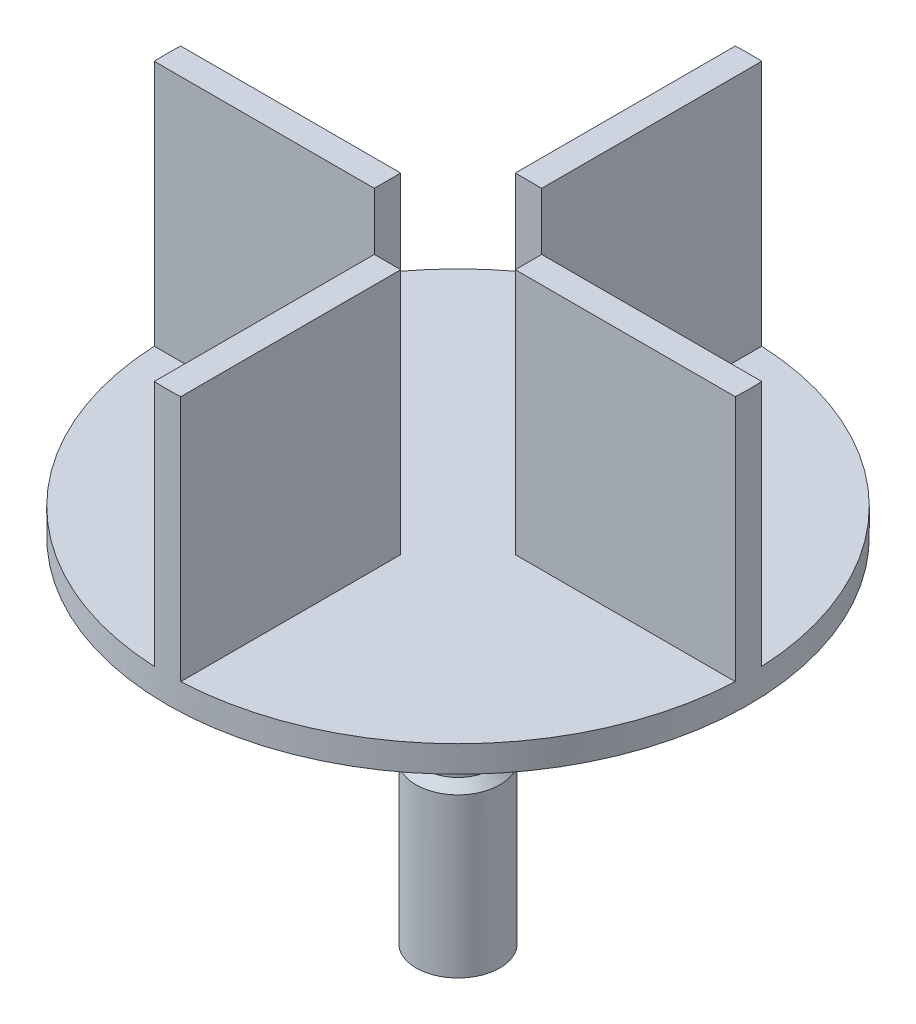
ISO-10303-21;
HEADER;
FILE_DESCRIPTION(('STEP AP214'),'2;1');
FILE_NAME('part.step','',(''),(''),'','','');
FILE_SCHEMA(('AUTOMOTIVE_DESIGN { 1 0 10303 214 1 1 1 1 }'));
ENDSEC;
DATA;
#1=APPLICATION_CONTEXT('core data for automotive mechanical design processes');
#2=APPLICATION_PROTOCOL_DEFINITION('international standard','automotive_design',2000,#1);
#3=PRODUCT_CONTEXT('',#1,'mechanical');
#4=PRODUCT('Part','Part','',(#3));
#5=PRODUCT_RELATED_PRODUCT_CATEGORY('part','',(#4));
#6=PRODUCT_DEFINITION_FORMATION('','',#4);
#7=PRODUCT_DEFINITION_CONTEXT('part definition',#1,'design');
#8=PRODUCT_DEFINITION('design','',#6,#7);
#9=PRODUCT_DEFINITION_SHAPE('','',#8);
#10=(LENGTH_UNIT() NAMED_UNIT(*) SI_UNIT(.MILLI.,.METRE.));
#11=(NAMED_UNIT(*) PLANE_ANGLE_UNIT() SI_UNIT($,.RADIAN.));
#12=(NAMED_UNIT(*) SI_UNIT($,.STERADIAN.) SOLID_ANGLE_UNIT());
#13=UNCERTAINTY_MEASURE_WITH_UNIT(LENGTH_MEASURE(1.E-05),#10,'distance_accuracy_value','');
#14=(GEOMETRIC_REPRESENTATION_CONTEXT(3) GLOBAL_UNCERTAINTY_ASSIGNED_CONTEXT((#13)) GLOBAL_UNIT_ASSIGNED_CONTEXT((#10,
#11,#12)) REPRESENTATION_CONTEXT('',''));
#15=CARTESIAN_POINT('',(0.,0.,0.));
#16=DIRECTION('',(0.,0.,1.));
#17=DIRECTION('',(1.,0.,0.));
#18=AXIS2_PLACEMENT_3D('',#15,#16,#17);
#19=CARTESIAN_POINT('',(0.,-40.,0.));
#20=DIRECTION('',(0.,1.,0.));
#21=DIRECTION('',(0.,0.,1.));
#22=AXIS2_PLACEMENT_3D('',#19,#20,#21);
#23=CYLINDRICAL_SURFACE('',#22,4.75);
#24=CARTESIAN_POINT('',(0.,-16.,0.));
#25=DIRECTION('',(0.,1.,0.));
#26=DIRECTION('',(0.,0.,1.));
#27=AXIS2_PLACEMENT_3D('',#24,#25,#26);
#28=CIRCLE('',#27,4.75);
#29=CARTESIAN_POINT('',(0.,-16.,4.75));
#30=VERTEX_POINT('',#29);
#31=EDGE_CURVE('E377',#30,#30,#28,.T.);
#32=ORIENTED_EDGE('',*,*,#31,.T.);
#33=EDGE_LOOP('',(#32));
#34=FACE_BOUND('',#33,.T.);
#35=CARTESIAN_POINT('',(0.,0.,0.));
#36=DIRECTION('',(0.,1.,0.));
#37=DIRECTION('',(0.,0.,1.));
#38=AXIS2_PLACEMENT_3D('',#35,#36,#37);
#39=CIRCLE('',#38,4.75);
#40=CARTESIAN_POINT('',(0.,0.,4.75));
#41=VERTEX_POINT('',#40);
#42=EDGE_CURVE('E11',#41,#41,#39,.F.);
#43=ORIENTED_EDGE('',*,*,#42,.T.);
#44=EDGE_LOOP('',(#43));
#45=FACE_BOUND('',#44,.T.);
#46=ADVANCED_FACE('F39',(#34,#45),#23,.T.);
#47=CARTESIAN_POINT('',(0.,3.,0.));
#48=DIRECTION('',(0.,1.,0.));
#49=DIRECTION('',(0.,0.,1.));
#50=AXIS2_PLACEMENT_3D('',#47,#48,#49);
#51=PLANE('',#50);
#52=CARTESIAN_POINT('',(0.,3.,0.));
#53=DIRECTION('',(0.,1.,0.));
#54=DIRECTION('',(0.,0.,1.));
#55=AXIS2_PLACEMENT_3D('',#52,#53,#54);
#56=CIRCLE('',#55,33.);
#57=CARTESIAN_POINT('',(1.50000000000001,3.,32.9658914637539));
#58=VERTEX_POINT('',#57);
#59=CARTESIAN_POINT('',(32.9658914637539,3.,1.49999999999966));
#60=VERTEX_POINT('',#59);
#61=EDGE_CURVE('E316',#58,#60,#56,.T.);
#62=ORIENTED_EDGE('',*,*,#61,.T.);
#63=DIRECTION('',(1.,0.,0.));
#64=VECTOR('',#63,1.);
#65=CARTESIAN_POINT('',(0.,3.,1.5));
#66=LINE('',#65,#64);
#67=CARTESIAN_POINT('',(8.00000000000002,3.,1.49999999999992));
#68=VERTEX_POINT('',#67);
#69=EDGE_CURVE('E55',#68,#60,#66,.T.);
#70=ORIENTED_EDGE('',*,*,#69,.F.);
#71=DIRECTION('',(0.,0.,1.));
#72=VECTOR('',#71,1.);
#73=CARTESIAN_POINT('',(8.,3.,0.));
#74=LINE('',#73,#72);
#75=CARTESIAN_POINT('',(7.99999999999998,3.,-1.50000000000008));
#76=VERTEX_POINT('',#75);
#77=EDGE_CURVE('E60',#76,#68,#74,.T.);
#78=ORIENTED_EDGE('',*,*,#77,.F.);
#79=DIRECTION('',(1.,0.,0.));
#80=VECTOR('',#79,1.);
#81=CARTESIAN_POINT('',(0.,3.,-1.49999999999999));
#82=LINE('',#81,#80);
#83=CARTESIAN_POINT('',(32.9658914637538,3.,-1.50000000000035));
#84=VERTEX_POINT('',#83);
#85=EDGE_CURVE('E172',#76,#84,#82,.T.);
#86=ORIENTED_EDGE('',*,*,#85,.T.);
#87=CARTESIAN_POINT('',(1.5,3.,-32.9658914637539));
#88=VERTEX_POINT('',#87);
#89=EDGE_CURVE('E310',#84,#88,#56,.T.);
#90=ORIENTED_EDGE('',*,*,#89,.T.);
#91=DIRECTION('',(0.,0.,-1.));
#92=VECTOR('',#91,1.);
#93=CARTESIAN_POINT('',(1.5,3.,0.));
#94=LINE('',#93,#92);
#95=CARTESIAN_POINT('',(1.5,3.,-8.));
#96=VERTEX_POINT('',#95);
#97=EDGE_CURVE('E286',#96,#88,#94,.T.);
#98=ORIENTED_EDGE('',*,*,#97,.F.);
#99=DIRECTION('',(1.,0.,0.));
#100=VECTOR('',#99,1.);
#101=CARTESIAN_POINT('',(0.,3.,-8.));
#102=LINE('',#101,#100);
#103=CARTESIAN_POINT('',(-1.5,3.,-8.));
#104=VERTEX_POINT('',#103);
#105=EDGE_CURVE('E266',#104,#96,#102,.T.);
#106=ORIENTED_EDGE('',*,*,#105,.F.);
#107=DIRECTION('',(0.,0.,-1.));
#108=VECTOR('',#107,1.);
#109=CARTESIAN_POINT('',(-1.49999999999999,3.,0.));
#110=LINE('',#109,#108);
#111=CARTESIAN_POINT('',(-1.50000000000001,3.,-32.9658914637539));
#112=VERTEX_POINT('',#111);
#113=EDGE_CURVE('E272',#104,#112,#110,.T.);
#114=ORIENTED_EDGE('',*,*,#113,.T.);
#115=CARTESIAN_POINT('',(-32.9658914637539,3.,-1.49999999999989));
#116=VERTEX_POINT('',#115);
#117=EDGE_CURVE('E48',#112,#116,#56,.T.);
#118=ORIENTED_EDGE('',*,*,#117,.T.);
#119=DIRECTION('',(-1.,0.,0.));
#120=VECTOR('',#119,1.);
#121=CARTESIAN_POINT('',(0.,3.,-1.5));
#122=LINE('',#121,#120);
#123=CARTESIAN_POINT('',(-8.00000000000001,3.,-1.49999999999998));
#124=VERTEX_POINT('',#123);
#125=EDGE_CURVE('E244',#124,#116,#122,.T.);
#126=ORIENTED_EDGE('',*,*,#125,.F.);
#127=DIRECTION('',(0.,0.,-1.));
#128=VECTOR('',#127,1.);
#129=CARTESIAN_POINT('',(-8.,3.,0.));
#130=LINE('',#129,#128);
#131=CARTESIAN_POINT('',(-7.99999999999999,3.,1.50000000000002));
#132=VERTEX_POINT('',#131);
#133=EDGE_CURVE('E224',#132,#124,#130,.T.);
#134=ORIENTED_EDGE('',*,*,#133,.F.);
#135=DIRECTION('',(-1.,0.,0.));
#136=VECTOR('',#135,1.);
#137=CARTESIAN_POINT('',(0.,3.,1.49999999999999));
#138=LINE('',#137,#136);
#139=CARTESIAN_POINT('',(-32.9658914637539,3.,1.50000000000012));
#140=VERTEX_POINT('',#139);
#141=EDGE_CURVE('E230',#132,#140,#138,.T.);
#142=ORIENTED_EDGE('',*,*,#141,.T.);
#143=CARTESIAN_POINT('',(-1.5,3.,32.9658914637539));
#144=VERTEX_POINT('',#143);
#145=EDGE_CURVE('E309',#140,#144,#56,.T.);
#146=ORIENTED_EDGE('',*,*,#145,.T.);
#147=DIRECTION('',(0.,0.,1.));
#148=VECTOR('',#147,1.);
#149=CARTESIAN_POINT('',(-1.5,3.,0.));
#150=LINE('',#149,#148);
#151=CARTESIAN_POINT('',(-1.5,3.,8.));
#152=VERTEX_POINT('',#151);
#153=EDGE_CURVE('E181',#152,#144,#150,.T.);
#154=ORIENTED_EDGE('',*,*,#153,.F.);
#155=DIRECTION('',(-1.,0.,0.));
#156=VECTOR('',#155,1.);
#157=CARTESIAN_POINT('',(0.,3.,8.));
#158=LINE('',#157,#156);
#159=CARTESIAN_POINT('',(1.5,3.,8.));
#160=VERTEX_POINT('',#159);
#161=EDGE_CURVE('E176',#160,#152,#158,.T.);
#162=ORIENTED_EDGE('',*,*,#161,.F.);
#163=DIRECTION('',(0.,0.,1.));
#164=VECTOR('',#163,1.);
#165=CARTESIAN_POINT('',(1.49999999999999,3.,0.));
#166=LINE('',#165,#164);
#167=EDGE_CURVE('E192',#160,#58,#166,.T.);
#168=ORIENTED_EDGE('',*,*,#167,.T.);
#169=EDGE_LOOP('',(#62,#70,#78,#86,#90,#98,#106,#114,#118,#126,#134,#142,#146,#154,#162,#168));
#170=FACE_BOUND('',#169,.T.);
#171=ADVANCED_FACE('F319',(#170),#51,.T.);
#172=CARTESIAN_POINT('',(0.,3.,0.));
#173=DIRECTION('',(0.,-1.,0.));
#174=DIRECTION('',(0.,0.,-1.));
#175=AXIS2_PLACEMENT_3D('',#172,#173,#174);
#176=CYLINDRICAL_SURFACE('',#175,33.);
#177=ORIENTED_EDGE('',*,*,#117,.F.);
#178=DIRECTION('',(0.,-1.,0.));
#179=VECTOR('',#178,1.);
#180=CARTESIAN_POINT('',(-1.50000000000001,31.,-32.9658914637539));
#181=LINE('',#180,#179);
#182=CARTESIAN_POINT('',(-1.50000000000001,31.,-32.9658914637539));
#183=VERTEX_POINT('',#182);
#184=EDGE_CURVE('E295',#183,#112,#181,.T.);
#185=ORIENTED_EDGE('',*,*,#184,.F.);
#186=CARTESIAN_POINT('',(0.,31.,0.));
#187=DIRECTION('',(0.,1.,0.));
#188=DIRECTION('',(0.,0.,1.));
#189=AXIS2_PLACEMENT_3D('',#186,#187,#188);
#190=CIRCLE('',#189,33.);
#191=CARTESIAN_POINT('',(1.5,31.,-32.9658914637539));
#192=VERTEX_POINT('',#191);
#193=EDGE_CURVE('E275',#192,#183,#190,.T.);
#194=ORIENTED_EDGE('',*,*,#193,.F.);
#195=DIRECTION('',(0.,-1.,0.));
#196=VECTOR('',#195,1.);
#197=CARTESIAN_POINT('',(1.5,31.,-32.9658914637539));
#198=LINE('',#197,#196);
#199=EDGE_CURVE('E299',#192,#88,#198,.T.);
#200=ORIENTED_EDGE('',*,*,#199,.T.);
#201=ORIENTED_EDGE('',*,*,#89,.F.);
#202=DIRECTION('',(0.,-1.,0.));
#203=VECTOR('',#202,1.);
#204=CARTESIAN_POINT('',(32.9658914637538,31.,-1.50000000000035));
#205=LINE('',#204,#203);
#206=CARTESIAN_POINT('',(32.9658914637538,31.,-1.50000000000035));
#207=VERTEX_POINT('',#206);
#208=EDGE_CURVE('E183',#207,#84,#205,.T.);
#209=ORIENTED_EDGE('',*,*,#208,.F.);
#210=CARTESIAN_POINT('',(0.,31.,0.));
#211=DIRECTION('',(0.,1.,0.));
#212=DIRECTION('',(-1.,0.,0.));
#213=AXIS2_PLACEMENT_3D('',#210,#211,#212);
#214=CIRCLE('',#213,33.);
#215=CARTESIAN_POINT('',(32.9658914637539,31.,1.49999999999966));
#216=VERTEX_POINT('',#215);
#217=EDGE_CURVE('E162',#216,#207,#214,.T.);
#218=ORIENTED_EDGE('',*,*,#217,.F.);
#219=DIRECTION('',(0.,-1.,0.));
#220=VECTOR('',#219,1.);
#221=CARTESIAN_POINT('',(32.9658914637539,31.,1.49999999999966));
#222=LINE('',#221,#220);
#223=EDGE_CURVE('E158',#216,#60,#222,.T.);
#224=ORIENTED_EDGE('',*,*,#223,.T.);
#225=ORIENTED_EDGE('',*,*,#61,.F.);
#226=DIRECTION('',(0.,-1.,0.));
#227=VECTOR('',#226,1.);
#228=CARTESIAN_POINT('',(1.50000000000001,31.,32.9658914637539));
#229=LINE('',#228,#227);
#230=CARTESIAN_POINT('',(1.50000000000001,31.,32.9658914637539));
#231=VERTEX_POINT('',#230);
#232=EDGE_CURVE('E212',#231,#58,#229,.T.);
#233=ORIENTED_EDGE('',*,*,#232,.F.);
#234=CARTESIAN_POINT('',(0.,31.,0.));
#235=DIRECTION('',(0.,1.,0.));
#236=DIRECTION('',(0.,0.,-1.));
#237=AXIS2_PLACEMENT_3D('',#234,#235,#236);
#238=CIRCLE('',#237,33.);
#239=CARTESIAN_POINT('',(-1.5,31.,32.9658914637539));
#240=VERTEX_POINT('',#239);
#241=EDGE_CURVE('E195',#240,#231,#238,.T.);
#242=ORIENTED_EDGE('',*,*,#241,.F.);
#243=DIRECTION('',(0.,-1.,0.));
#244=VECTOR('',#243,1.);
#245=CARTESIAN_POINT('',(-1.5,31.,32.9658914637539));
#246=LINE('',#245,#244);
#247=EDGE_CURVE('E216',#240,#144,#246,.T.);
#248=ORIENTED_EDGE('',*,*,#247,.T.);
#249=ORIENTED_EDGE('',*,*,#145,.F.);
#250=DIRECTION('',(0.,-1.,0.));
#251=VECTOR('',#250,1.);
#252=CARTESIAN_POINT('',(-32.9658914637539,31.,1.50000000000012));
#253=LINE('',#252,#251);
#254=CARTESIAN_POINT('',(-32.9658914637539,31.,1.50000000000012));
#255=VERTEX_POINT('',#254);
#256=EDGE_CURVE('E254',#255,#140,#253,.T.);
#257=ORIENTED_EDGE('',*,*,#256,.F.);
#258=CARTESIAN_POINT('',(0.,31.,0.));
#259=DIRECTION('',(0.,1.,0.));
#260=DIRECTION('',(1.,0.,0.));
#261=AXIS2_PLACEMENT_3D('',#258,#259,#260);
#262=CIRCLE('',#261,33.);
#263=CARTESIAN_POINT('',(-32.9658914637539,31.,-1.49999999999989));
#264=VERTEX_POINT('',#263);
#265=EDGE_CURVE('E233',#264,#255,#262,.T.);
#266=ORIENTED_EDGE('',*,*,#265,.F.);
#267=DIRECTION('',(0.,-1.,0.));
#268=VECTOR('',#267,1.);
#269=CARTESIAN_POINT('',(-32.9658914637539,31.,-1.49999999999989));
#270=LINE('',#269,#268);
#271=EDGE_CURVE('E258',#264,#116,#270,.T.);
#272=ORIENTED_EDGE('',*,*,#271,.T.);
#273=EDGE_LOOP('',(#177,#185,#194,#200,#201,#209,#218,#224,#225,#233,#242,#248,#249,#257,#266,#272));
#274=FACE_BOUND('',#273,.T.);
#275=CARTESIAN_POINT('',(0.,0.,0.));
#276=DIRECTION('',(0.,1.,0.));
#277=DIRECTION('',(0.,0.,1.));
#278=AXIS2_PLACEMENT_3D('',#275,#276,#277);
#279=CIRCLE('',#278,33.);
#280=CARTESIAN_POINT('',(0.,0.,33.));
#281=VERTEX_POINT('',#280);
#282=EDGE_CURVE('E307',#281,#281,#279,.T.);
#283=ORIENTED_EDGE('',*,*,#282,.T.);
#284=EDGE_LOOP('',(#283));
#285=FACE_BOUND('',#284,.T.);
#286=ADVANCED_FACE('F41',(#274,#285),#176,.T.);
#287=CARTESIAN_POINT('',(0.,0.,0.));
#288=DIRECTION('',(0.,1.,0.));
#289=DIRECTION('',(0.,0.,1.));
#290=AXIS2_PLACEMENT_3D('',#287,#288,#289);
#291=PLANE('',#290);
#292=ORIENTED_EDGE('',*,*,#42,.F.);
#293=EDGE_LOOP('',(#292));
#294=FACE_BOUND('',#293,.T.);
#295=ORIENTED_EDGE('',*,*,#282,.F.);
#296=EDGE_LOOP('',(#295));
#297=FACE_BOUND('',#296,.T.);
#298=ADVANCED_FACE('F450',(#294,#297),#291,.F.);
#299=CARTESIAN_POINT('',(0.,31.,-8.));
#300=DIRECTION('',(0.,0.,-1.));
#301=DIRECTION('',(-1.,0.,0.));
#302=AXIS2_PLACEMENT_3D('',#299,#300,#301);
#303=PLANE('',#302);
#304=ORIENTED_EDGE('',*,*,#105,.T.);
#305=DIRECTION('',(0.,-1.,0.));
#306=VECTOR('',#305,1.);
#307=CARTESIAN_POINT('',(1.5,31.,-8.));
#308=LINE('',#307,#306);
#309=CARTESIAN_POINT('',(1.5,31.,-8.));
#310=VERTEX_POINT('',#309);
#311=EDGE_CURVE('E303',#310,#96,#308,.T.);
#312=ORIENTED_EDGE('',*,*,#311,.F.);
#313=DIRECTION('',(1.,0.,0.));
#314=VECTOR('',#313,1.);
#315=CARTESIAN_POINT('',(0.,31.,-8.));
#316=LINE('',#315,#314);
#317=CARTESIAN_POINT('',(-1.5,31.,-8.));
#318=VERTEX_POINT('',#317);
#319=EDGE_CURVE('E267',#318,#310,#316,.T.);
#320=ORIENTED_EDGE('',*,*,#319,.F.);
#321=DIRECTION('',(0.,-1.,0.));
#322=VECTOR('',#321,1.);
#323=CARTESIAN_POINT('',(-1.5,31.,-8.));
#324=LINE('',#323,#322);
#325=EDGE_CURVE('E282',#318,#104,#324,.T.);
#326=ORIENTED_EDGE('',*,*,#325,.T.);
#327=EDGE_LOOP('',(#304,#312,#320,#326));
#328=FACE_BOUND('',#327,.T.);
#329=ADVANCED_FACE('F411',(#328),#303,.F.);
#330=CARTESIAN_POINT('',(1.5,31.,0.));
#331=DIRECTION('',(-1.,0.,0.));
#332=DIRECTION('',(0.,0.,1.));
#333=AXIS2_PLACEMENT_3D('',#330,#331,#332);
#334=PLANE('',#333);
#335=ORIENTED_EDGE('',*,*,#97,.T.);
#336=ORIENTED_EDGE('',*,*,#199,.F.);
#337=DIRECTION('',(0.,0.,-1.));
#338=VECTOR('',#337,1.);
#339=CARTESIAN_POINT('',(1.5,31.,0.));
#340=LINE('',#339,#338);
#341=EDGE_CURVE('E271',#310,#192,#340,.T.);
#342=ORIENTED_EDGE('',*,*,#341,.F.);
#343=ORIENTED_EDGE('',*,*,#311,.T.);
#344=EDGE_LOOP('',(#335,#336,#342,#343));
#345=FACE_BOUND('',#344,.T.);
#346=ADVANCED_FACE('F406',(#345),#334,.F.);
#347=CARTESIAN_POINT('',(-1.49999999999999,31.,0.));
#348=DIRECTION('',(-1.,0.,0.));
#349=DIRECTION('',(0.,0.,1.));
#350=AXIS2_PLACEMENT_3D('',#347,#348,#349);
#351=PLANE('',#350);
#352=ORIENTED_EDGE('',*,*,#113,.F.);
#353=ORIENTED_EDGE('',*,*,#325,.F.);
#354=DIRECTION('',(0.,0.,-1.));
#355=VECTOR('',#354,1.);
#356=CARTESIAN_POINT('',(-1.49999999999999,31.,0.));
#357=LINE('',#356,#355);
#358=EDGE_CURVE('E278',#318,#183,#357,.T.);
#359=ORIENTED_EDGE('',*,*,#358,.T.);
#360=ORIENTED_EDGE('',*,*,#184,.T.);
#361=EDGE_LOOP('',(#352,#353,#359,#360));
#362=FACE_BOUND('',#361,.T.);
#363=ADVANCED_FACE('F414',(#362),#351,.T.);
#364=CARTESIAN_POINT('',(0.,31.,0.));
#365=DIRECTION('',(0.,1.,0.));
#366=DIRECTION('',(0.,0.,1.));
#367=AXIS2_PLACEMENT_3D('',#364,#365,#366);
#368=PLANE('',#367);
#369=ORIENTED_EDGE('',*,*,#319,.T.);
#370=ORIENTED_EDGE('',*,*,#341,.T.);
#371=ORIENTED_EDGE('',*,*,#193,.T.);
#372=ORIENTED_EDGE('',*,*,#358,.F.);
#373=EDGE_LOOP('',(#369,#370,#371,#372));
#374=FACE_BOUND('',#373,.T.);
#375=ADVANCED_FACE('F441',(#374),#368,.T.);
#376=CARTESIAN_POINT('',(-8.,31.,0.));
#377=DIRECTION('',(-1.,0.,0.));
#378=DIRECTION('',(0.,0.,1.));
#379=AXIS2_PLACEMENT_3D('',#376,#377,#378);
#380=PLANE('',#379);
#381=ORIENTED_EDGE('',*,*,#133,.T.);
#382=DIRECTION('',(0.,-1.,0.));
#383=VECTOR('',#382,1.);
#384=CARTESIAN_POINT('',(-8.00000000000001,31.,-1.49999999999998));
#385=LINE('',#384,#383);
#386=CARTESIAN_POINT('',(-8.00000000000001,31.,-1.49999999999998));
#387=VERTEX_POINT('',#386);
#388=EDGE_CURVE('E262',#387,#124,#385,.T.);
#389=ORIENTED_EDGE('',*,*,#388,.F.);
#390=DIRECTION('',(0.,0.,-1.));
#391=VECTOR('',#390,1.);
#392=CARTESIAN_POINT('',(-8.,31.,0.));
#393=LINE('',#392,#391);
#394=CARTESIAN_POINT('',(-7.99999999999999,31.,1.50000000000002));
#395=VERTEX_POINT('',#394);
#396=EDGE_CURVE('E225',#395,#387,#393,.T.);
#397=ORIENTED_EDGE('',*,*,#396,.F.);
#398=DIRECTION('',(0.,-1.,0.));
#399=VECTOR('',#398,1.);
#400=CARTESIAN_POINT('',(-7.99999999999999,31.,1.50000000000002));
#401=LINE('',#400,#399);
#402=EDGE_CURVE('E240',#395,#132,#401,.T.);
#403=ORIENTED_EDGE('',*,*,#402,.T.);
#404=EDGE_LOOP('',(#381,#389,#397,#403));
#405=FACE_BOUND('',#404,.T.);
#406=ADVANCED_FACE('F422',(#405),#380,.F.);
#407=CARTESIAN_POINT('',(0.,31.,-1.5));
#408=DIRECTION('',(0.,0.,1.));
#409=DIRECTION('',(1.,0.,0.));
#410=AXIS2_PLACEMENT_3D('',#407,#408,#409);
#411=PLANE('',#410);
#412=ORIENTED_EDGE('',*,*,#125,.T.);
#413=ORIENTED_EDGE('',*,*,#271,.F.);
#414=DIRECTION('',(-1.,0.,0.));
#415=VECTOR('',#414,1.);
#416=CARTESIAN_POINT('',(0.,31.,-1.5));
#417=LINE('',#416,#415);
#418=EDGE_CURVE('E229',#387,#264,#417,.T.);
#419=ORIENTED_EDGE('',*,*,#418,.F.);
#420=ORIENTED_EDGE('',*,*,#388,.T.);
#421=EDGE_LOOP('',(#412,#413,#419,#420));
#422=FACE_BOUND('',#421,.T.);
#423=ADVANCED_FACE('F418',(#422),#411,.F.);
#424=CARTESIAN_POINT('',(0.,31.,1.49999999999999));
#425=DIRECTION('',(0.,0.,1.));
#426=DIRECTION('',(1.,0.,0.));
#427=AXIS2_PLACEMENT_3D('',#424,#425,#426);
#428=PLANE('',#427);
#429=ORIENTED_EDGE('',*,*,#141,.F.);
#430=ORIENTED_EDGE('',*,*,#402,.F.);
#431=DIRECTION('',(-1.,0.,0.));
#432=VECTOR('',#431,1.);
#433=CARTESIAN_POINT('',(0.,31.,1.49999999999999));
#434=LINE('',#433,#432);
#435=EDGE_CURVE('E236',#395,#255,#434,.T.);
#436=ORIENTED_EDGE('',*,*,#435,.T.);
#437=ORIENTED_EDGE('',*,*,#256,.T.);
#438=EDGE_LOOP('',(#429,#430,#436,#437));
#439=FACE_BOUND('',#438,.T.);
#440=ADVANCED_FACE('F425',(#439),#428,.T.);
#441=CARTESIAN_POINT('',(0.,31.,0.));
#442=DIRECTION('',(0.,1.,0.));
#443=DIRECTION('',(1.,0.,0.));
#444=AXIS2_PLACEMENT_3D('',#441,#442,#443);
#445=PLANE('',#444);
#446=ORIENTED_EDGE('',*,*,#396,.T.);
#447=ORIENTED_EDGE('',*,*,#418,.T.);
#448=ORIENTED_EDGE('',*,*,#265,.T.);
#449=ORIENTED_EDGE('',*,*,#435,.F.);
#450=EDGE_LOOP('',(#446,#447,#448,#449));
#451=FACE_BOUND('',#450,.T.);
#452=ADVANCED_FACE('F427',(#451),#445,.T.);
#453=CARTESIAN_POINT('',(0.,31.,8.));
#454=DIRECTION('',(0.,0.,1.));
#455=DIRECTION('',(1.,0.,0.));
#456=AXIS2_PLACEMENT_3D('',#453,#454,#455);
#457=PLANE('',#456);
#458=ORIENTED_EDGE('',*,*,#161,.T.);
#459=DIRECTION('',(0.,-1.,0.));
#460=VECTOR('',#459,1.);
#461=CARTESIAN_POINT('',(-1.5,31.,8.));
#462=LINE('',#461,#460);
#463=CARTESIAN_POINT('',(-1.5,31.,8.));
#464=VERTEX_POINT('',#463);
#465=EDGE_CURVE('E220',#464,#152,#462,.T.);
#466=ORIENTED_EDGE('',*,*,#465,.F.);
#467=DIRECTION('',(-1.,0.,0.));
#468=VECTOR('',#467,1.);
#469=CARTESIAN_POINT('',(0.,31.,8.));
#470=LINE('',#469,#468);
#471=CARTESIAN_POINT('',(1.5,31.,8.));
#472=VERTEX_POINT('',#471);
#473=EDGE_CURVE('E187',#472,#464,#470,.T.);
#474=ORIENTED_EDGE('',*,*,#473,.F.);
#475=DIRECTION('',(0.,-1.,0.));
#476=VECTOR('',#475,1.);
#477=CARTESIAN_POINT('',(1.5,31.,8.));
#478=LINE('',#477,#476);
#479=EDGE_CURVE('E201',#472,#160,#478,.T.);
#480=ORIENTED_EDGE('',*,*,#479,.T.);
#481=EDGE_LOOP('',(#458,#466,#474,#480));
#482=FACE_BOUND('',#481,.T.);
#483=ADVANCED_FACE('F335',(#482),#457,.F.);
#484=CARTESIAN_POINT('',(-1.5,31.,0.));
#485=DIRECTION('',(1.,0.,0.));
#486=DIRECTION('',(0.,0.,-1.));
#487=AXIS2_PLACEMENT_3D('',#484,#485,#486);
#488=PLANE('',#487);
#489=ORIENTED_EDGE('',*,*,#153,.T.);
#490=ORIENTED_EDGE('',*,*,#247,.F.);
#491=DIRECTION('',(0.,0.,1.));
#492=VECTOR('',#491,1.);
#493=CARTESIAN_POINT('',(-1.5,31.,0.));
#494=LINE('',#493,#492);
#495=EDGE_CURVE('E191',#464,#240,#494,.T.);
#496=ORIENTED_EDGE('',*,*,#495,.F.);
#497=ORIENTED_EDGE('',*,*,#465,.T.);
#498=EDGE_LOOP('',(#489,#490,#496,#497));
#499=FACE_BOUND('',#498,.T.);
#500=ADVANCED_FACE('F325',(#499),#488,.F.);
#501=CARTESIAN_POINT('',(1.49999999999999,31.,0.));
#502=DIRECTION('',(1.,0.,0.));
#503=DIRECTION('',(0.,0.,-1.));
#504=AXIS2_PLACEMENT_3D('',#501,#502,#503);
#505=PLANE('',#504);
#506=ORIENTED_EDGE('',*,*,#167,.F.);
#507=ORIENTED_EDGE('',*,*,#479,.F.);
#508=DIRECTION('',(0.,0.,1.));
#509=VECTOR('',#508,1.);
#510=CARTESIAN_POINT('',(1.49999999999999,31.,0.));
#511=LINE('',#510,#509);
#512=EDGE_CURVE('E198',#472,#231,#511,.T.);
#513=ORIENTED_EDGE('',*,*,#512,.T.);
#514=ORIENTED_EDGE('',*,*,#232,.T.);
#515=EDGE_LOOP('',(#506,#507,#513,#514));
#516=FACE_BOUND('',#515,.T.);
#517=ADVANCED_FACE('F338',(#516),#505,.T.);
#518=CARTESIAN_POINT('',(0.,31.,0.));
#519=DIRECTION('',(0.,1.,0.));
#520=DIRECTION('',(0.,0.,-1.));
#521=AXIS2_PLACEMENT_3D('',#518,#519,#520);
#522=PLANE('',#521);
#523=ORIENTED_EDGE('',*,*,#473,.T.);
#524=ORIENTED_EDGE('',*,*,#495,.T.);
#525=ORIENTED_EDGE('',*,*,#241,.T.);
#526=ORIENTED_EDGE('',*,*,#512,.F.);
#527=EDGE_LOOP('',(#523,#524,#525,#526));
#528=FACE_BOUND('',#527,.T.);
#529=ADVANCED_FACE('F332',(#528),#522,.T.);
#530=CARTESIAN_POINT('',(8.,31.,0.));
#531=DIRECTION('',(1.,0.,0.));
#532=DIRECTION('',(0.,0.,-1.));
#533=AXIS2_PLACEMENT_3D('',#530,#531,#532);
#534=PLANE('',#533);
#535=ORIENTED_EDGE('',*,*,#77,.T.);
#536=DIRECTION('',(0.,-1.,0.));
#537=VECTOR('',#536,1.);
#538=CARTESIAN_POINT('',(8.00000000000002,31.,1.49999999999992));
#539=LINE('',#538,#537);
#540=CARTESIAN_POINT('',(8.00000000000002,31.,1.49999999999992));
#541=VERTEX_POINT('',#540);
#542=EDGE_CURVE('E156',#541,#68,#539,.T.);
#543=ORIENTED_EDGE('',*,*,#542,.F.);
#544=DIRECTION('',(0.,0.,1.));
#545=VECTOR('',#544,1.);
#546=CARTESIAN_POINT('',(8.,31.,0.));
#547=LINE('',#546,#545);
#548=CARTESIAN_POINT('',(7.99999999999998,31.,-1.50000000000008));
#549=VERTEX_POINT('',#548);
#550=EDGE_CURVE('E163',#549,#541,#547,.T.);
#551=ORIENTED_EDGE('',*,*,#550,.F.);
#552=DIRECTION('',(0.,-1.,0.));
#553=VECTOR('',#552,1.);
#554=CARTESIAN_POINT('',(7.99999999999998,31.,-1.50000000000008));
#555=LINE('',#554,#553);
#556=EDGE_CURVE('E389',#549,#76,#555,.T.);
#557=ORIENTED_EDGE('',*,*,#556,.T.);
#558=EDGE_LOOP('',(#535,#543,#551,#557));
#559=FACE_BOUND('',#558,.T.);
#560=ADVANCED_FACE('F174',(#559),#534,.F.);
#561=CARTESIAN_POINT('',(0.,31.,1.5));
#562=DIRECTION('',(0.,0.,-1.));
#563=DIRECTION('',(-1.,0.,0.));
#564=AXIS2_PLACEMENT_3D('',#561,#562,#563);
#565=PLANE('',#564);
#566=ORIENTED_EDGE('',*,*,#69,.T.);
#567=ORIENTED_EDGE('',*,*,#223,.F.);
#568=DIRECTION('',(1.,0.,0.));
#569=VECTOR('',#568,1.);
#570=CARTESIAN_POINT('',(0.,31.,1.5));
#571=LINE('',#570,#569);
#572=EDGE_CURVE('E152',#541,#216,#571,.T.);
#573=ORIENTED_EDGE('',*,*,#572,.F.);
#574=ORIENTED_EDGE('',*,*,#542,.T.);
#575=EDGE_LOOP('',(#566,#567,#573,#574));
#576=FACE_BOUND('',#575,.T.);
#577=ADVANCED_FACE('F154',(#576),#565,.F.);
#578=CARTESIAN_POINT('',(0.,31.,-1.49999999999999));
#579=DIRECTION('',(0.,0.,-1.));
#580=DIRECTION('',(-1.,0.,0.));
#581=AXIS2_PLACEMENT_3D('',#578,#579,#580);
#582=PLANE('',#581);
#583=ORIENTED_EDGE('',*,*,#85,.F.);
#584=ORIENTED_EDGE('',*,*,#556,.F.);
#585=DIRECTION('',(1.,0.,0.));
#586=VECTOR('',#585,1.);
#587=CARTESIAN_POINT('',(0.,31.,-1.49999999999999));
#588=LINE('',#587,#586);
#589=EDGE_CURVE('E169',#549,#207,#588,.T.);
#590=ORIENTED_EDGE('',*,*,#589,.T.);
#591=ORIENTED_EDGE('',*,*,#208,.T.);
#592=EDGE_LOOP('',(#583,#584,#590,#591));
#593=FACE_BOUND('',#592,.T.);
#594=ADVANCED_FACE('F401',(#593),#582,.T.);
#595=CARTESIAN_POINT('',(0.,31.,0.));
#596=DIRECTION('',(0.,1.,0.));
#597=DIRECTION('',(-1.,0.,0.));
#598=AXIS2_PLACEMENT_3D('',#595,#596,#597);
#599=PLANE('',#598);
#600=ORIENTED_EDGE('',*,*,#550,.T.);
#601=ORIENTED_EDGE('',*,*,#572,.T.);
#602=ORIENTED_EDGE('',*,*,#217,.T.);
#603=ORIENTED_EDGE('',*,*,#589,.F.);
#604=EDGE_LOOP('',(#600,#601,#602,#603));
#605=FACE_BOUND('',#604,.T.);
#606=ADVANCED_FACE('F167',(#605),#599,.T.);
#607=CARTESIAN_POINT('',(0.,-17.,0.));
#608=DIRECTION('',(0.,1.,0.));
#609=DIRECTION('',(0.,0.,1.));
#610=AXIS2_PLACEMENT_3D('',#607,#608,#609);
#611=CONICAL_SURFACE('',#610,3.75,0.785398163397443);
#612=ORIENTED_EDGE('',*,*,#31,.F.);
#613=EDGE_LOOP('',(#612));
#614=FACE_BOUND('',#613,.T.);
#615=CARTESIAN_POINT('',(0.,-17.,0.));
#616=DIRECTION('',(0.,1.,0.));
#617=DIRECTION('',(0.,0.,1.));
#618=AXIS2_PLACEMENT_3D('',#615,#616,#617);
#619=CIRCLE('',#618,3.75);
#620=CARTESIAN_POINT('',(0.,-17.,3.75));
#621=VERTEX_POINT('',#620);
#622=EDGE_CURVE('E382',#621,#621,#619,.T.);
#623=ORIENTED_EDGE('',*,*,#622,.T.);
#624=EDGE_LOOP('',(#623));
#625=FACE_BOUND('',#624,.T.);
#626=ADVANCED_FACE('F557',(#614,#625),#611,.T.);
#627=CARTESIAN_POINT('',(0.,0.,0.));
#628=DIRECTION('',(0.,1.,0.));
#629=DIRECTION('',(0.,0.,1.));
#630=AXIS2_PLACEMENT_3D('',#627,#628,#629);
#631=CYLINDRICAL_SURFACE('',#630,3.75);
#632=ORIENTED_EDGE('',*,*,#622,.F.);
#633=EDGE_LOOP('',(#632));
#634=FACE_BOUND('',#633,.T.);
#635=CARTESIAN_POINT('',(0.,-21.,0.));
#636=DIRECTION('',(0.,1.,0.));
#637=DIRECTION('',(0.,0.,1.));
#638=AXIS2_PLACEMENT_3D('',#635,#636,#637);
#639=CIRCLE('',#638,3.75);
#640=CARTESIAN_POINT('',(0.,-21.,3.75));
#641=VERTEX_POINT('',#640);
#642=EDGE_CURVE('E606',#641,#641,#639,.T.);
#643=ORIENTED_EDGE('',*,*,#642,.T.);
#644=EDGE_LOOP('',(#643));
#645=FACE_BOUND('',#644,.T.);
#646=ADVANCED_FACE('F581',(#634,#645),#631,.T.);
#647=CARTESIAN_POINT('',(0.,-22.,0.));
#648=DIRECTION('',(0.,-1.,0.));
#649=DIRECTION('',(0.,0.,-1.));
#650=AXIS2_PLACEMENT_3D('',#647,#648,#649);
#651=CONICAL_SURFACE('',#650,4.75,0.785398163397453);
#652=ORIENTED_EDGE('',*,*,#642,.F.);
#653=EDGE_LOOP('',(#652));
#654=FACE_BOUND('',#653,.T.);
#655=CARTESIAN_POINT('',(0.,-22.,0.));
#656=DIRECTION('',(0.,1.,0.));
#657=DIRECTION('',(0.,0.,1.));
#658=AXIS2_PLACEMENT_3D('',#655,#656,#657);
#659=CIRCLE('',#658,4.75);
#660=CARTESIAN_POINT('',(0.,-22.,4.75));
#661=VERTEX_POINT('',#660);
#662=EDGE_CURVE('E372',#661,#661,#659,.T.);
#663=ORIENTED_EDGE('',*,*,#662,.T.);
#664=EDGE_LOOP('',(#663));
#665=FACE_BOUND('',#664,.T.);
#666=ADVANCED_FACE('F367',(#654,#665),#651,.T.);
#667=CARTESIAN_POINT('',(0.,-40.,0.));
#668=DIRECTION('',(0.,-1.,0.));
#669=DIRECTION('',(0.,0.,-1.));
#670=AXIS2_PLACEMENT_3D('',#667,#668,#669);
#671=PLANE('',#670);
#672=CARTESIAN_POINT('',(0.,-40.,0.));
#673=DIRECTION('',(0.,-1.,0.));
#674=DIRECTION('',(0.,0.,-1.));
#675=AXIS2_PLACEMENT_3D('',#672,#673,#674);
#676=CIRCLE('',#675,4.75);
#677=CARTESIAN_POINT('',(0.,-40.,-4.75));
#678=VERTEX_POINT('',#677);
#679=EDGE_CURVE('E375',#678,#678,#676,.T.);
#680=ORIENTED_EDGE('',*,*,#679,.T.);
#681=EDGE_LOOP('',(#680));
#682=FACE_BOUND('',#681,.T.);
#683=ADVANCED_FACE('F362',(#682),#671,.T.);
#684=ORIENTED_EDGE('',*,*,#662,.F.);
#685=EDGE_LOOP('',(#684));
#686=FACE_BOUND('',#685,.T.);
#687=ORIENTED_EDGE('',*,*,#679,.F.);
#688=EDGE_LOOP('',(#687));
#689=FACE_BOUND('',#688,.T.);
#690=ADVANCED_FACE('F350',(#686,#689),#23,.T.);
#691=CLOSED_SHELL('',(#46,#171,#286,#298,#329,#346,#363,#375,#406,#423,#440,#452,#483,#500,#517,
#529,#560,#577,#594,#606,#626,#646,#666,#683,#690));
#692=MANIFOLD_SOLID_BREP('B2',#691);
#693=ADVANCED_BREP_SHAPE_REPRESENTATION('',(#18,#692),#14);
#694=SHAPE_DEFINITION_REPRESENTATION(#9,#693);
ENDSEC;
END-ISO-10303-21;
